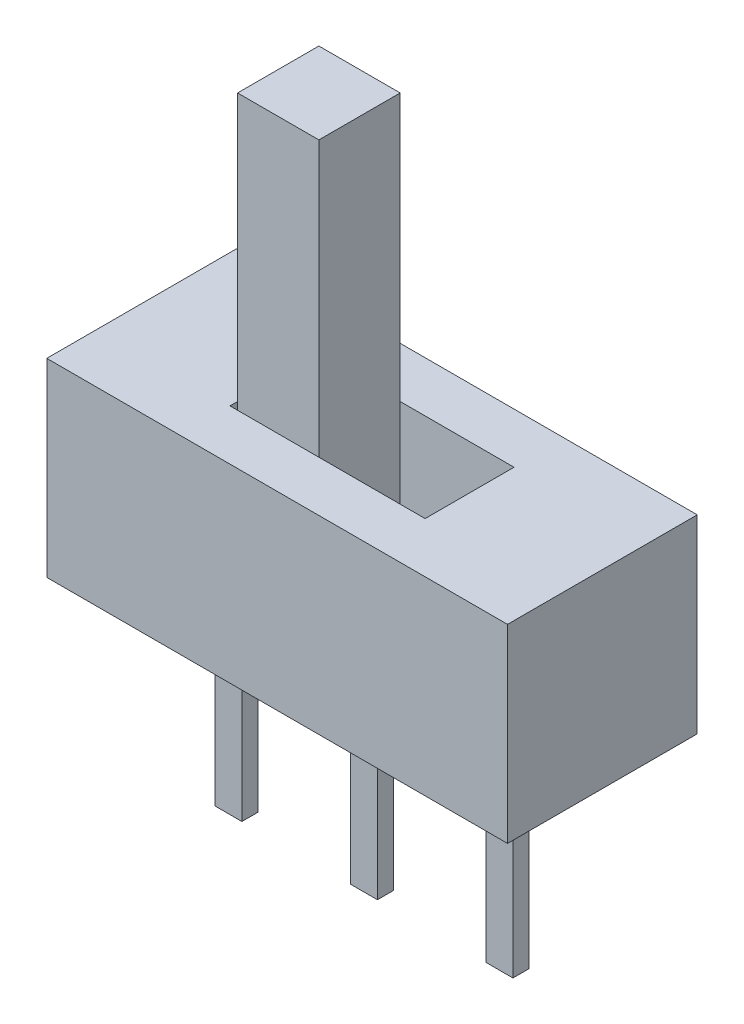
ISO-10303-21;
HEADER;
FILE_DESCRIPTION(('STEP AP214'),'2;1');
FILE_NAME('part.step','',(''),(''),'','','');
FILE_SCHEMA(('AUTOMOTIVE_DESIGN { 1 0 10303 214 1 1 1 1 }'));
ENDSEC;
DATA;
#1=APPLICATION_CONTEXT('core data for automotive mechanical design processes');
#2=APPLICATION_PROTOCOL_DEFINITION('international standard','automotive_design',2000,#1);
#3=PRODUCT_CONTEXT('',#1,'mechanical');
#4=PRODUCT('Part','Part','',(#3));
#5=PRODUCT_RELATED_PRODUCT_CATEGORY('part','',(#4));
#6=PRODUCT_DEFINITION_FORMATION('','',#4);
#7=PRODUCT_DEFINITION_CONTEXT('part definition',#1,'design');
#8=PRODUCT_DEFINITION('design','',#6,#7);
#9=PRODUCT_DEFINITION_SHAPE('','',#8);
#10=(LENGTH_UNIT() NAMED_UNIT(*) SI_UNIT(.MILLI.,.METRE.));
#11=(NAMED_UNIT(*) PLANE_ANGLE_UNIT() SI_UNIT($,.RADIAN.));
#12=(NAMED_UNIT(*) SI_UNIT($,.STERADIAN.) SOLID_ANGLE_UNIT());
#13=UNCERTAINTY_MEASURE_WITH_UNIT(LENGTH_MEASURE(1.E-05),#10,'distance_accuracy_value','');
#14=(GEOMETRIC_REPRESENTATION_CONTEXT(3) GLOBAL_UNCERTAINTY_ASSIGNED_CONTEXT((#13)) GLOBAL_UNIT_ASSIGNED_CONTEXT((#10,
#11,#12)) REPRESENTATION_CONTEXT('',''));
#15=CARTESIAN_POINT('',(0.,0.,0.));
#16=DIRECTION('',(0.,0.,1.));
#17=DIRECTION('',(1.,0.,0.));
#18=AXIS2_PLACEMENT_3D('',#15,#16,#17);
#19=CARTESIAN_POINT('',(0.,0.,0.));
#20=DIRECTION('',(0.,1.,0.));
#21=DIRECTION('',(0.,0.,1.));
#22=AXIS2_PLACEMENT_3D('',#19,#20,#21);
#23=PLANE('',#22);
#24=DIRECTION('',(0.,0.,1.));
#25=VECTOR('',#24,1.);
#26=CARTESIAN_POINT('',(-2.25,0.,0.15));
#27=LINE('',#26,#25);
#28=CARTESIAN_POINT('',(-2.25,0.,-0.15));
#29=VERTEX_POINT('',#28);
#30=CARTESIAN_POINT('',(-2.25,0.,0.15));
#31=VERTEX_POINT('',#30);
#32=EDGE_CURVE('E264',#29,#31,#27,.T.);
#33=ORIENTED_EDGE('',*,*,#32,.F.);
#34=DIRECTION('',(1.,0.,0.));
#35=VECTOR('',#34,1.);
#36=CARTESIAN_POINT('',(-2.75,0.,-0.15));
#37=LINE('',#36,#35);
#38=CARTESIAN_POINT('',(-2.75,0.,-0.15));
#39=VERTEX_POINT('',#38);
#40=EDGE_CURVE('E234',#39,#29,#37,.T.);
#41=ORIENTED_EDGE('',*,*,#40,.F.);
#42=DIRECTION('',(0.,0.,-1.));
#43=VECTOR('',#42,1.);
#44=CARTESIAN_POINT('',(-2.75,0.,0.15));
#45=LINE('',#44,#43);
#46=CARTESIAN_POINT('',(-2.75,0.,0.15));
#47=VERTEX_POINT('',#46);
#48=EDGE_CURVE('E252',#47,#39,#45,.T.);
#49=ORIENTED_EDGE('',*,*,#48,.F.);
#50=DIRECTION('',(-1.,0.,0.));
#51=VECTOR('',#50,1.);
#52=CARTESIAN_POINT('',(-2.75,0.,0.15));
#53=LINE('',#52,#51);
#54=EDGE_CURVE('E258',#31,#47,#53,.T.);
#55=ORIENTED_EDGE('',*,*,#54,.F.);
#56=EDGE_LOOP('',(#33,#41,#49,#55));
#57=FACE_BOUND('',#56,.T.);
#58=DIRECTION('',(0.,0.,-1.));
#59=VECTOR('',#58,1.);
#60=CARTESIAN_POINT('',(4.25,0.,-1.75));
#61=LINE('',#60,#59);
#62=CARTESIAN_POINT('',(4.25,0.,1.75));
#63=VERTEX_POINT('',#62);
#64=CARTESIAN_POINT('',(4.25,0.,-1.75));
#65=VERTEX_POINT('',#64);
#66=EDGE_CURVE('E357',#63,#65,#61,.T.);
#67=ORIENTED_EDGE('',*,*,#66,.F.);
#68=DIRECTION('',(1.,0.,0.));
#69=VECTOR('',#68,1.);
#70=CARTESIAN_POINT('',(-4.25,0.,1.75));
#71=LINE('',#70,#69);
#72=CARTESIAN_POINT('',(-4.25,0.,1.75));
#73=VERTEX_POINT('',#72);
#74=EDGE_CURVE('E368',#73,#63,#71,.T.);
#75=ORIENTED_EDGE('',*,*,#74,.F.);
#76=DIRECTION('',(0.,0.,1.));
#77=VECTOR('',#76,1.);
#78=CARTESIAN_POINT('',(-4.25,0.,-1.75));
#79=LINE('',#78,#77);
#80=CARTESIAN_POINT('',(-4.25,0.,-1.75));
#81=VERTEX_POINT('',#80);
#82=EDGE_CURVE('E379',#81,#73,#79,.T.);
#83=ORIENTED_EDGE('',*,*,#82,.F.);
#84=DIRECTION('',(-1.,0.,0.));
#85=VECTOR('',#84,1.);
#86=CARTESIAN_POINT('',(-4.25,0.,-1.75));
#87=LINE('',#86,#85);
#88=EDGE_CURVE('E377',#65,#81,#87,.T.);
#89=ORIENTED_EDGE('',*,*,#88,.F.);
#90=EDGE_LOOP('',(#67,#75,#83,#89));
#91=FACE_BOUND('',#90,.T.);
#92=DIRECTION('',(0.,0.,1.));
#93=VECTOR('',#92,1.);
#94=CARTESIAN_POINT('',(0.25,0.,0.15));
#95=LINE('',#94,#93);
#96=CARTESIAN_POINT('',(0.25,0.,-0.15));
#97=VERTEX_POINT('',#96);
#98=CARTESIAN_POINT('',(0.25,0.,0.15));
#99=VERTEX_POINT('',#98);
#100=EDGE_CURVE('E229',#97,#99,#95,.T.);
#101=ORIENTED_EDGE('',*,*,#100,.F.);
#102=DIRECTION('',(1.,0.,0.));
#103=VECTOR('',#102,1.);
#104=CARTESIAN_POINT('',(-0.25,0.,-0.15));
#105=LINE('',#104,#103);
#106=CARTESIAN_POINT('',(-0.25,0.,-0.15));
#107=VERTEX_POINT('',#106);
#108=EDGE_CURVE('E271',#107,#97,#105,.T.);
#109=ORIENTED_EDGE('',*,*,#108,.F.);
#110=DIRECTION('',(0.,0.,-1.));
#111=VECTOR('',#110,1.);
#112=CARTESIAN_POINT('',(-0.25,0.,0.15));
#113=LINE('',#112,#111);
#114=CARTESIAN_POINT('',(-0.25,0.,0.15));
#115=VERTEX_POINT('',#114);
#116=EDGE_CURVE('E283',#115,#107,#113,.T.);
#117=ORIENTED_EDGE('',*,*,#116,.F.);
#118=DIRECTION('',(-1.,0.,0.));
#119=VECTOR('',#118,1.);
#120=CARTESIAN_POINT('',(-0.25,0.,0.15));
#121=LINE('',#120,#119);
#122=EDGE_CURVE('E280',#99,#115,#121,.T.);
#123=ORIENTED_EDGE('',*,*,#122,.F.);
#124=EDGE_LOOP('',(#101,#109,#117,#123));
#125=FACE_BOUND('',#124,.T.);
#126=DIRECTION('',(0.,0.,1.));
#127=VECTOR('',#126,1.);
#128=CARTESIAN_POINT('',(2.75,0.,0.15));
#129=LINE('',#128,#127);
#130=CARTESIAN_POINT('',(2.75,0.,-0.15));
#131=VERTEX_POINT('',#130);
#132=CARTESIAN_POINT('',(2.75,0.,0.15));
#133=VERTEX_POINT('',#132);
#134=EDGE_CURVE('E227',#131,#133,#129,.T.);
#135=ORIENTED_EDGE('',*,*,#134,.F.);
#136=DIRECTION('',(1.,0.,0.));
#137=VECTOR('',#136,1.);
#138=CARTESIAN_POINT('',(2.25,0.,-0.15));
#139=LINE('',#138,#137);
#140=CARTESIAN_POINT('',(2.25,0.,-0.15));
#141=VERTEX_POINT('',#140);
#142=EDGE_CURVE('E216',#141,#131,#139,.T.);
#143=ORIENTED_EDGE('',*,*,#142,.F.);
#144=DIRECTION('',(0.,0.,-1.));
#145=VECTOR('',#144,1.);
#146=CARTESIAN_POINT('',(2.25,0.,0.15));
#147=LINE('',#146,#145);
#148=CARTESIAN_POINT('',(2.25,0.,0.15));
#149=VERTEX_POINT('',#148);
#150=EDGE_CURVE('E66',#149,#141,#147,.T.);
#151=ORIENTED_EDGE('',*,*,#150,.F.);
#152=DIRECTION('',(-1.,0.,0.));
#153=VECTOR('',#152,1.);
#154=CARTESIAN_POINT('',(2.25,0.,0.15));
#155=LINE('',#154,#153);
#156=EDGE_CURVE('E61',#133,#149,#155,.T.);
#157=ORIENTED_EDGE('',*,*,#156,.F.);
#158=EDGE_LOOP('',(#135,#143,#151,#157));
#159=FACE_BOUND('',#158,.T.);
#160=ADVANCED_FACE('F46',(#57,#91,#125,#159),#23,.F.);
#161=CARTESIAN_POINT('',(0.,1.5,0.));
#162=DIRECTION('',(0.,1.,0.));
#163=DIRECTION('',(0.,0.,1.));
#164=AXIS2_PLACEMENT_3D('',#161,#162,#163);
#165=PLANE('',#164);
#166=DIRECTION('',(0.,0.,-1.));
#167=VECTOR('',#166,1.);
#168=CARTESIAN_POINT('',(1.8,1.5,-0.82));
#169=LINE('',#168,#167);
#170=CARTESIAN_POINT('',(1.8,1.5,0.82));
#171=VERTEX_POINT('',#170);
#172=CARTESIAN_POINT('',(1.8,1.5,-0.82));
#173=VERTEX_POINT('',#172);
#174=EDGE_CURVE('E332',#171,#173,#169,.T.);
#175=ORIENTED_EDGE('',*,*,#174,.T.);
#176=DIRECTION('',(-1.,0.,0.));
#177=VECTOR('',#176,1.);
#178=CARTESIAN_POINT('',(-1.8,1.5,-0.82));
#179=LINE('',#178,#177);
#180=CARTESIAN_POINT('',(-1.8,1.5,-0.82));
#181=VERTEX_POINT('',#180);
#182=EDGE_CURVE('E335',#173,#181,#179,.T.);
#183=ORIENTED_EDGE('',*,*,#182,.T.);
#184=DIRECTION('',(0.,0.,1.));
#185=VECTOR('',#184,1.);
#186=CARTESIAN_POINT('',(-1.8,1.5,-0.82));
#187=LINE('',#186,#185);
#188=CARTESIAN_POINT('',(-1.8,1.5,0.82));
#189=VERTEX_POINT('',#188);
#190=EDGE_CURVE('E339',#181,#189,#187,.T.);
#191=ORIENTED_EDGE('',*,*,#190,.T.);
#192=DIRECTION('',(1.,0.,0.));
#193=VECTOR('',#192,1.);
#194=CARTESIAN_POINT('',(-1.8,1.5,0.82));
#195=LINE('',#194,#193);
#196=EDGE_CURVE('E342',#189,#171,#195,.T.);
#197=ORIENTED_EDGE('',*,*,#196,.T.);
#198=EDGE_LOOP('',(#175,#183,#191,#197));
#199=FACE_BOUND('',#198,.T.);
#200=DIRECTION('',(-1.,0.,0.));
#201=VECTOR('',#200,1.);
#202=CARTESIAN_POINT('',(-1.73,1.5,-0.75));
#203=LINE('',#202,#201);
#204=CARTESIAN_POINT('',(-0.23,1.5,-0.75));
#205=VERTEX_POINT('',#204);
#206=CARTESIAN_POINT('',(-1.73,1.5,-0.75));
#207=VERTEX_POINT('',#206);
#208=EDGE_CURVE('E308',#205,#207,#203,.T.);
#209=ORIENTED_EDGE('',*,*,#208,.F.);
#210=DIRECTION('',(0.,0.,-1.));
#211=VECTOR('',#210,1.);
#212=CARTESIAN_POINT('',(-0.23,1.5,-0.75));
#213=LINE('',#212,#211);
#214=CARTESIAN_POINT('',(-0.23,1.5,0.75));
#215=VERTEX_POINT('',#214);
#216=EDGE_CURVE('E312',#215,#205,#213,.T.);
#217=ORIENTED_EDGE('',*,*,#216,.F.);
#218=DIRECTION('',(1.,0.,0.));
#219=VECTOR('',#218,1.);
#220=CARTESIAN_POINT('',(-1.73,1.5,0.75));
#221=LINE('',#220,#219);
#222=CARTESIAN_POINT('',(-1.73,1.5,0.75));
#223=VERTEX_POINT('',#222);
#224=EDGE_CURVE('E300',#223,#215,#221,.T.);
#225=ORIENTED_EDGE('',*,*,#224,.F.);
#226=DIRECTION('',(0.,0.,1.));
#227=VECTOR('',#226,1.);
#228=CARTESIAN_POINT('',(-1.73,1.5,-0.75));
#229=LINE('',#228,#227);
#230=EDGE_CURVE('E305',#207,#223,#229,.T.);
#231=ORIENTED_EDGE('',*,*,#230,.F.);
#232=EDGE_LOOP('',(#209,#217,#225,#231));
#233=FACE_BOUND('',#232,.T.);
#234=ADVANCED_FACE('F414',(#199,#233),#165,.T.);
#235=CARTESIAN_POINT('',(4.25,3.5,-1.75));
#236=DIRECTION('',(-1.,0.,0.));
#237=DIRECTION('',(0.,0.,1.));
#238=AXIS2_PLACEMENT_3D('',#235,#236,#237);
#239=PLANE('',#238);
#240=ORIENTED_EDGE('',*,*,#66,.T.);
#241=DIRECTION('',(0.,-1.,0.));
#242=VECTOR('',#241,1.);
#243=CARTESIAN_POINT('',(4.25,3.5,-1.75));
#244=LINE('',#243,#242);
#245=CARTESIAN_POINT('',(4.25,3.5,-1.75));
#246=VERTEX_POINT('',#245);
#247=EDGE_CURVE('E12',#246,#65,#244,.T.);
#248=ORIENTED_EDGE('',*,*,#247,.F.);
#249=DIRECTION('',(0.,0.,-1.));
#250=VECTOR('',#249,1.);
#251=CARTESIAN_POINT('',(4.25,3.5,-1.75));
#252=LINE('',#251,#250);
#253=CARTESIAN_POINT('',(4.25,3.5,1.75));
#254=VERTEX_POINT('',#253);
#255=EDGE_CURVE('E364',#254,#246,#252,.T.);
#256=ORIENTED_EDGE('',*,*,#255,.F.);
#257=DIRECTION('',(0.,-1.,0.));
#258=VECTOR('',#257,1.);
#259=CARTESIAN_POINT('',(4.25,3.5,1.75));
#260=LINE('',#259,#258);
#261=EDGE_CURVE('E374',#254,#63,#260,.T.);
#262=ORIENTED_EDGE('',*,*,#261,.T.);
#263=EDGE_LOOP('',(#240,#248,#256,#262));
#264=FACE_BOUND('',#263,.T.);
#265=ADVANCED_FACE('F48',(#264),#239,.F.);
#266=CARTESIAN_POINT('',(-4.25,3.5,-1.75));
#267=DIRECTION('',(0.,0.,1.));
#268=DIRECTION('',(1.,0.,0.));
#269=AXIS2_PLACEMENT_3D('',#266,#267,#268);
#270=PLANE('',#269);
#271=ORIENTED_EDGE('',*,*,#88,.T.);
#272=DIRECTION('',(0.,-1.,0.));
#273=VECTOR('',#272,1.);
#274=CARTESIAN_POINT('',(-4.25,3.5,-1.75));
#275=LINE('',#274,#273);
#276=CARTESIAN_POINT('',(-4.25,3.5,-1.75));
#277=VERTEX_POINT('',#276);
#278=EDGE_CURVE('E54',#277,#81,#275,.T.);
#279=ORIENTED_EDGE('',*,*,#278,.F.);
#280=DIRECTION('',(-1.,0.,0.));
#281=VECTOR('',#280,1.);
#282=CARTESIAN_POINT('',(-4.25,3.5,-1.75));
#283=LINE('',#282,#281);
#284=EDGE_CURVE('E367',#246,#277,#283,.T.);
#285=ORIENTED_EDGE('',*,*,#284,.F.);
#286=ORIENTED_EDGE('',*,*,#247,.T.);
#287=EDGE_LOOP('',(#271,#279,#285,#286));
#288=FACE_BOUND('',#287,.T.);
#289=ADVANCED_FACE('F407',(#288),#270,.F.);
#290=CARTESIAN_POINT('',(-4.25,3.5,-1.75));
#291=DIRECTION('',(1.,0.,0.));
#292=DIRECTION('',(0.,0.,-1.));
#293=AXIS2_PLACEMENT_3D('',#290,#291,#292);
#294=PLANE('',#293);
#295=ORIENTED_EDGE('',*,*,#82,.T.);
#296=DIRECTION('',(0.,-1.,0.));
#297=VECTOR('',#296,1.);
#298=CARTESIAN_POINT('',(-4.25,3.5,1.75));
#299=LINE('',#298,#297);
#300=CARTESIAN_POINT('',(-4.25,3.5,1.75));
#301=VERTEX_POINT('',#300);
#302=EDGE_CURVE('E384',#301,#73,#299,.T.);
#303=ORIENTED_EDGE('',*,*,#302,.F.);
#304=DIRECTION('',(0.,0.,1.));
#305=VECTOR('',#304,1.);
#306=CARTESIAN_POINT('',(-4.25,3.5,-1.75));
#307=LINE('',#306,#305);
#308=EDGE_CURVE('E370',#277,#301,#307,.T.);
#309=ORIENTED_EDGE('',*,*,#308,.F.);
#310=ORIENTED_EDGE('',*,*,#278,.T.);
#311=EDGE_LOOP('',(#295,#303,#309,#310));
#312=FACE_BOUND('',#311,.T.);
#313=ADVANCED_FACE('F391',(#312),#294,.F.);
#314=CARTESIAN_POINT('',(-4.25,3.5,1.75));
#315=DIRECTION('',(0.,0.,-1.));
#316=DIRECTION('',(-1.,0.,0.));
#317=AXIS2_PLACEMENT_3D('',#314,#315,#316);
#318=PLANE('',#317);
#319=ORIENTED_EDGE('',*,*,#74,.T.);
#320=ORIENTED_EDGE('',*,*,#261,.F.);
#321=DIRECTION('',(1.,0.,0.));
#322=VECTOR('',#321,1.);
#323=CARTESIAN_POINT('',(-4.25,3.5,1.75));
#324=LINE('',#323,#322);
#325=EDGE_CURVE('E372',#301,#254,#324,.T.);
#326=ORIENTED_EDGE('',*,*,#325,.F.);
#327=ORIENTED_EDGE('',*,*,#302,.T.);
#328=EDGE_LOOP('',(#319,#320,#326,#327));
#329=FACE_BOUND('',#328,.T.);
#330=ADVANCED_FACE('F400',(#329),#318,.F.);
#331=CARTESIAN_POINT('',(0.,3.5,0.));
#332=DIRECTION('',(0.,1.,0.));
#333=DIRECTION('',(0.,0.,1.));
#334=AXIS2_PLACEMENT_3D('',#331,#332,#333);
#335=PLANE('',#334);
#336=DIRECTION('',(0.,0.,-1.));
#337=VECTOR('',#336,1.);
#338=CARTESIAN_POINT('',(1.8,3.5,-0.82));
#339=LINE('',#338,#337);
#340=CARTESIAN_POINT('',(1.8,3.5,0.82));
#341=VERTEX_POINT('',#340);
#342=CARTESIAN_POINT('',(1.8,3.5,-0.82));
#343=VERTEX_POINT('',#342);
#344=EDGE_CURVE('E318',#341,#343,#339,.T.);
#345=ORIENTED_EDGE('',*,*,#344,.F.);
#346=DIRECTION('',(1.,0.,0.));
#347=VECTOR('',#346,1.);
#348=CARTESIAN_POINT('',(-1.8,3.5,0.82));
#349=LINE('',#348,#347);
#350=CARTESIAN_POINT('',(-1.8,3.5,0.82));
#351=VERTEX_POINT('',#350);
#352=EDGE_CURVE('E336',#351,#341,#349,.T.);
#353=ORIENTED_EDGE('',*,*,#352,.F.);
#354=DIRECTION('',(0.,0.,1.));
#355=VECTOR('',#354,1.);
#356=CARTESIAN_POINT('',(-1.8,3.5,-0.82));
#357=LINE('',#356,#355);
#358=CARTESIAN_POINT('',(-1.8,3.5,-0.82));
#359=VERTEX_POINT('',#358);
#360=EDGE_CURVE('E350',#359,#351,#357,.T.);
#361=ORIENTED_EDGE('',*,*,#360,.F.);
#362=DIRECTION('',(-1.,0.,0.));
#363=VECTOR('',#362,1.);
#364=CARTESIAN_POINT('',(-1.8,3.5,-0.82));
#365=LINE('',#364,#363);
#366=EDGE_CURVE('E347',#343,#359,#365,.T.);
#367=ORIENTED_EDGE('',*,*,#366,.F.);
#368=EDGE_LOOP('',(#345,#353,#361,#367));
#369=FACE_BOUND('',#368,.T.);
#370=ORIENTED_EDGE('',*,*,#255,.T.);
#371=ORIENTED_EDGE('',*,*,#284,.T.);
#372=ORIENTED_EDGE('',*,*,#308,.T.);
#373=ORIENTED_EDGE('',*,*,#325,.T.);
#374=EDGE_LOOP('',(#370,#371,#372,#373));
#375=FACE_BOUND('',#374,.T.);
#376=ADVANCED_FACE('F406',(#369,#375),#335,.T.);
#377=CARTESIAN_POINT('',(1.8,1.5,-0.82));
#378=DIRECTION('',(1.,0.,0.));
#379=DIRECTION('',(0.,0.,-1.));
#380=AXIS2_PLACEMENT_3D('',#377,#378,#379);
#381=PLANE('',#380);
#382=ORIENTED_EDGE('',*,*,#344,.T.);
#383=DIRECTION('',(0.,1.,0.));
#384=VECTOR('',#383,1.);
#385=CARTESIAN_POINT('',(1.8,1.5,-0.82));
#386=LINE('',#385,#384);
#387=EDGE_CURVE('E345',#173,#343,#386,.T.);
#388=ORIENTED_EDGE('',*,*,#387,.F.);
#389=ORIENTED_EDGE('',*,*,#174,.F.);
#390=DIRECTION('',(0.,1.,0.));
#391=VECTOR('',#390,1.);
#392=CARTESIAN_POINT('',(1.8,1.5,0.82));
#393=LINE('',#392,#391);
#394=EDGE_CURVE('E355',#171,#341,#393,.T.);
#395=ORIENTED_EDGE('',*,*,#394,.T.);
#396=EDGE_LOOP('',(#382,#388,#389,#395));
#397=FACE_BOUND('',#396,.T.);
#398=ADVANCED_FACE('F430',(#397),#381,.F.);
#399=CARTESIAN_POINT('',(-1.8,1.5,0.82));
#400=DIRECTION('',(0.,0.,1.));
#401=DIRECTION('',(1.,0.,0.));
#402=AXIS2_PLACEMENT_3D('',#399,#400,#401);
#403=PLANE('',#402);
#404=ORIENTED_EDGE('',*,*,#352,.T.);
#405=ORIENTED_EDGE('',*,*,#394,.F.);
#406=ORIENTED_EDGE('',*,*,#196,.F.);
#407=DIRECTION('',(0.,1.,0.));
#408=VECTOR('',#407,1.);
#409=CARTESIAN_POINT('',(-1.8,1.5,0.82));
#410=LINE('',#409,#408);
#411=EDGE_CURVE('E358',#189,#351,#410,.T.);
#412=ORIENTED_EDGE('',*,*,#411,.T.);
#413=EDGE_LOOP('',(#404,#405,#406,#412));
#414=FACE_BOUND('',#413,.T.);
#415=ADVANCED_FACE('F435',(#414),#403,.F.);
#416=CARTESIAN_POINT('',(-1.8,1.5,-0.82));
#417=DIRECTION('',(-1.,0.,0.));
#418=DIRECTION('',(0.,0.,1.));
#419=AXIS2_PLACEMENT_3D('',#416,#417,#418);
#420=PLANE('',#419);
#421=ORIENTED_EDGE('',*,*,#360,.T.);
#422=ORIENTED_EDGE('',*,*,#411,.F.);
#423=ORIENTED_EDGE('',*,*,#190,.F.);
#424=DIRECTION('',(0.,1.,0.));
#425=VECTOR('',#424,1.);
#426=CARTESIAN_POINT('',(-1.8,1.5,-0.82));
#427=LINE('',#426,#425);
#428=EDGE_CURVE('E360',#181,#359,#427,.T.);
#429=ORIENTED_EDGE('',*,*,#428,.T.);
#430=EDGE_LOOP('',(#421,#422,#423,#429));
#431=FACE_BOUND('',#430,.T.);
#432=ADVANCED_FACE('F450',(#431),#420,.F.);
#433=CARTESIAN_POINT('',(-1.8,1.5,-0.82));
#434=DIRECTION('',(0.,0.,-1.));
#435=DIRECTION('',(-1.,0.,0.));
#436=AXIS2_PLACEMENT_3D('',#433,#434,#435);
#437=PLANE('',#436);
#438=ORIENTED_EDGE('',*,*,#366,.T.);
#439=ORIENTED_EDGE('',*,*,#428,.F.);
#440=ORIENTED_EDGE('',*,*,#182,.F.);
#441=ORIENTED_EDGE('',*,*,#387,.T.);
#442=EDGE_LOOP('',(#438,#439,#440,#441));
#443=FACE_BOUND('',#442,.T.);
#444=ADVANCED_FACE('F444',(#443),#437,.F.);
#445=CARTESIAN_POINT('',(-0.23,15.6213203435596,-0.75));
#446=DIRECTION('',(-1.,0.,0.));
#447=DIRECTION('',(0.,0.,1.));
#448=AXIS2_PLACEMENT_3D('',#445,#446,#447);
#449=PLANE('',#448);
#450=DIRECTION('',(0.,0.,-1.));
#451=VECTOR('',#450,1.);
#452=CARTESIAN_POINT('',(-0.23,8.5,-0.75));
#453=LINE('',#452,#451);
#454=CARTESIAN_POINT('',(-0.23,8.5,0.75));
#455=VERTEX_POINT('',#454);
#456=CARTESIAN_POINT('',(-0.23,8.5,-0.75));
#457=VERTEX_POINT('',#456);
#458=EDGE_CURVE('E322',#455,#457,#453,.T.);
#459=ORIENTED_EDGE('',*,*,#458,.F.);
#460=DIRECTION('',(0.,-1.,0.));
#461=VECTOR('',#460,1.);
#462=CARTESIAN_POINT('',(-0.23,15.6213203435596,0.75));
#463=LINE('',#462,#461);
#464=EDGE_CURVE('E299',#455,#215,#463,.T.);
#465=ORIENTED_EDGE('',*,*,#464,.T.);
#466=ORIENTED_EDGE('',*,*,#216,.T.);
#467=DIRECTION('',(0.,-1.,0.));
#468=VECTOR('',#467,1.);
#469=CARTESIAN_POINT('',(-0.23,15.6213203435596,-0.75));
#470=LINE('',#469,#468);
#471=EDGE_CURVE('E311',#457,#205,#470,.T.);
#472=ORIENTED_EDGE('',*,*,#471,.F.);
#473=EDGE_LOOP('',(#459,#465,#466,#472));
#474=FACE_BOUND('',#473,.T.);
#475=ADVANCED_FACE('F457',(#474),#449,.F.);
#476=CARTESIAN_POINT('',(-1.73,15.6213203435596,-0.75));
#477=DIRECTION('',(0.,0.,1.));
#478=DIRECTION('',(1.,0.,0.));
#479=AXIS2_PLACEMENT_3D('',#476,#477,#478);
#480=PLANE('',#479);
#481=DIRECTION('',(-1.,0.,0.));
#482=VECTOR('',#481,1.);
#483=CARTESIAN_POINT('',(-1.73,8.5,-0.75));
#484=LINE('',#483,#482);
#485=CARTESIAN_POINT('',(-1.73,8.5,-0.75));
#486=VERTEX_POINT('',#485);
#487=EDGE_CURVE('E319',#457,#486,#484,.T.);
#488=ORIENTED_EDGE('',*,*,#487,.F.);
#489=ORIENTED_EDGE('',*,*,#471,.T.);
#490=ORIENTED_EDGE('',*,*,#208,.T.);
#491=DIRECTION('',(0.,-1.,0.));
#492=VECTOR('',#491,1.);
#493=CARTESIAN_POINT('',(-1.73,15.6213203435596,-0.75));
#494=LINE('',#493,#492);
#495=EDGE_CURVE('E307',#486,#207,#494,.T.);
#496=ORIENTED_EDGE('',*,*,#495,.F.);
#497=EDGE_LOOP('',(#488,#489,#490,#496));
#498=FACE_BOUND('',#497,.T.);
#499=ADVANCED_FACE('F469',(#498),#480,.F.);
#500=CARTESIAN_POINT('',(-1.73,15.6213203435596,-0.75));
#501=DIRECTION('',(1.,0.,0.));
#502=DIRECTION('',(0.,0.,-1.));
#503=AXIS2_PLACEMENT_3D('',#500,#501,#502);
#504=PLANE('',#503);
#505=DIRECTION('',(0.,0.,1.));
#506=VECTOR('',#505,1.);
#507=CARTESIAN_POINT('',(-1.73,8.5,-0.75));
#508=LINE('',#507,#506);
#509=CARTESIAN_POINT('',(-1.73,8.5,0.75));
#510=VERTEX_POINT('',#509);
#511=EDGE_CURVE('E315',#486,#510,#508,.T.);
#512=ORIENTED_EDGE('',*,*,#511,.F.);
#513=ORIENTED_EDGE('',*,*,#495,.T.);
#514=ORIENTED_EDGE('',*,*,#230,.T.);
#515=DIRECTION('',(0.,-1.,0.));
#516=VECTOR('',#515,1.);
#517=CARTESIAN_POINT('',(-1.73,15.6213203435596,0.75));
#518=LINE('',#517,#516);
#519=EDGE_CURVE('E304',#510,#223,#518,.T.);
#520=ORIENTED_EDGE('',*,*,#519,.F.);
#521=EDGE_LOOP('',(#512,#513,#514,#520));
#522=FACE_BOUND('',#521,.T.);
#523=ADVANCED_FACE('F473',(#522),#504,.F.);
#524=CARTESIAN_POINT('',(-1.73,15.6213203435596,0.75));
#525=DIRECTION('',(0.,0.,-1.));
#526=DIRECTION('',(-1.,0.,0.));
#527=AXIS2_PLACEMENT_3D('',#524,#525,#526);
#528=PLANE('',#527);
#529=DIRECTION('',(1.,0.,0.));
#530=VECTOR('',#529,1.);
#531=CARTESIAN_POINT('',(-1.73,8.5,0.75));
#532=LINE('',#531,#530);
#533=EDGE_CURVE('E303',#510,#455,#532,.T.);
#534=ORIENTED_EDGE('',*,*,#533,.F.);
#535=ORIENTED_EDGE('',*,*,#519,.T.);
#536=ORIENTED_EDGE('',*,*,#224,.T.);
#537=ORIENTED_EDGE('',*,*,#464,.F.);
#538=EDGE_LOOP('',(#534,#535,#536,#537));
#539=FACE_BOUND('',#538,.T.);
#540=ADVANCED_FACE('F465',(#539),#528,.F.);
#541=CARTESIAN_POINT('',(0.,8.5,0.));
#542=DIRECTION('',(0.,1.,0.));
#543=DIRECTION('',(0.,0.,1.));
#544=AXIS2_PLACEMENT_3D('',#541,#542,#543);
#545=PLANE('',#544);
#546=ORIENTED_EDGE('',*,*,#533,.T.);
#547=ORIENTED_EDGE('',*,*,#458,.T.);
#548=ORIENTED_EDGE('',*,*,#487,.T.);
#549=ORIENTED_EDGE('',*,*,#511,.T.);
#550=EDGE_LOOP('',(#546,#547,#548,#549));
#551=FACE_BOUND('',#550,.T.);
#552=ADVANCED_FACE('F461',(#551),#545,.T.);
#553=CARTESIAN_POINT('',(0.25,-3.7,0.15));
#554=DIRECTION('',(-1.,0.,0.));
#555=DIRECTION('',(0.,0.,1.));
#556=AXIS2_PLACEMENT_3D('',#553,#554,#555);
#557=PLANE('',#556);
#558=ORIENTED_EDGE('',*,*,#100,.T.);
#559=DIRECTION('',(0.,1.,0.));
#560=VECTOR('',#559,1.);
#561=CARTESIAN_POINT('',(0.25,-3.7,0.15));
#562=LINE('',#561,#560);
#563=CARTESIAN_POINT('',(0.25,-3.7,0.15));
#564=VERTEX_POINT('',#563);
#565=EDGE_CURVE('E296',#564,#99,#562,.T.);
#566=ORIENTED_EDGE('',*,*,#565,.F.);
#567=DIRECTION('',(0.,0.,1.));
#568=VECTOR('',#567,1.);
#569=CARTESIAN_POINT('',(0.25,-3.7,0.15));
#570=LINE('',#569,#568);
#571=CARTESIAN_POINT('',(0.25,-3.7,-0.15));
#572=VERTEX_POINT('',#571);
#573=EDGE_CURVE('E267',#572,#564,#570,.T.);
#574=ORIENTED_EDGE('',*,*,#573,.F.);
#575=DIRECTION('',(0.,1.,0.));
#576=VECTOR('',#575,1.);
#577=CARTESIAN_POINT('',(0.25,-3.7,-0.15));
#578=LINE('',#577,#576);
#579=EDGE_CURVE('E277',#572,#97,#578,.T.);
#580=ORIENTED_EDGE('',*,*,#579,.T.);
#581=EDGE_LOOP('',(#558,#566,#574,#580));
#582=FACE_BOUND('',#581,.T.);
#583=ADVANCED_FACE('F464',(#582),#557,.F.);
#584=CARTESIAN_POINT('',(-0.25,-3.7,0.15));
#585=DIRECTION('',(0.,0.,-1.));
#586=DIRECTION('',(-1.,0.,0.));
#587=AXIS2_PLACEMENT_3D('',#584,#585,#586);
#588=PLANE('',#587);
#589=ORIENTED_EDGE('',*,*,#122,.T.);
#590=DIRECTION('',(0.,1.,0.));
#591=VECTOR('',#590,1.);
#592=CARTESIAN_POINT('',(-0.25,-3.7,0.15));
#593=LINE('',#592,#591);
#594=CARTESIAN_POINT('',(-0.25,-3.7,0.15));
#595=VERTEX_POINT('',#594);
#596=EDGE_CURVE('E293',#595,#115,#593,.T.);
#597=ORIENTED_EDGE('',*,*,#596,.F.);
#598=DIRECTION('',(-1.,0.,0.));
#599=VECTOR('',#598,1.);
#600=CARTESIAN_POINT('',(-0.25,-3.7,0.15));
#601=LINE('',#600,#599);
#602=EDGE_CURVE('E270',#564,#595,#601,.T.);
#603=ORIENTED_EDGE('',*,*,#602,.F.);
#604=ORIENTED_EDGE('',*,*,#565,.T.);
#605=EDGE_LOOP('',(#589,#597,#603,#604));
#606=FACE_BOUND('',#605,.T.);
#607=ADVANCED_FACE('F483',(#606),#588,.F.);
#608=CARTESIAN_POINT('',(-0.25,-3.7,0.15));
#609=DIRECTION('',(1.,0.,0.));
#610=DIRECTION('',(0.,0.,-1.));
#611=AXIS2_PLACEMENT_3D('',#608,#609,#610);
#612=PLANE('',#611);
#613=ORIENTED_EDGE('',*,*,#116,.T.);
#614=DIRECTION('',(0.,1.,0.));
#615=VECTOR('',#614,1.);
#616=CARTESIAN_POINT('',(-0.25,-3.7,-0.15));
#617=LINE('',#616,#615);
#618=CARTESIAN_POINT('',(-0.25,-3.7,-0.15));
#619=VERTEX_POINT('',#618);
#620=EDGE_CURVE('E290',#619,#107,#617,.T.);
#621=ORIENTED_EDGE('',*,*,#620,.F.);
#622=DIRECTION('',(0.,0.,-1.));
#623=VECTOR('',#622,1.);
#624=CARTESIAN_POINT('',(-0.25,-3.7,0.15));
#625=LINE('',#624,#623);
#626=EDGE_CURVE('E273',#595,#619,#625,.T.);
#627=ORIENTED_EDGE('',*,*,#626,.F.);
#628=ORIENTED_EDGE('',*,*,#596,.T.);
#629=EDGE_LOOP('',(#613,#621,#627,#628));
#630=FACE_BOUND('',#629,.T.);
#631=ADVANCED_FACE('F487',(#630),#612,.F.);
#632=CARTESIAN_POINT('',(-0.25,-3.7,-0.15));
#633=DIRECTION('',(0.,0.,1.));
#634=DIRECTION('',(1.,0.,0.));
#635=AXIS2_PLACEMENT_3D('',#632,#633,#634);
#636=PLANE('',#635);
#637=ORIENTED_EDGE('',*,*,#108,.T.);
#638=ORIENTED_EDGE('',*,*,#579,.F.);
#639=DIRECTION('',(1.,0.,0.));
#640=VECTOR('',#639,1.);
#641=CARTESIAN_POINT('',(-0.25,-3.7,-0.15));
#642=LINE('',#641,#640);
#643=EDGE_CURVE('E275',#619,#572,#642,.T.);
#644=ORIENTED_EDGE('',*,*,#643,.F.);
#645=ORIENTED_EDGE('',*,*,#620,.T.);
#646=EDGE_LOOP('',(#637,#638,#644,#645));
#647=FACE_BOUND('',#646,.T.);
#648=ADVANCED_FACE('F491',(#647),#636,.F.);
#649=CARTESIAN_POINT('',(0.,-3.7,0.));
#650=DIRECTION('',(0.,-1.,0.));
#651=DIRECTION('',(0.,0.,-1.));
#652=AXIS2_PLACEMENT_3D('',#649,#650,#651);
#653=PLANE('',#652);
#654=ORIENTED_EDGE('',*,*,#573,.T.);
#655=ORIENTED_EDGE('',*,*,#602,.T.);
#656=ORIENTED_EDGE('',*,*,#626,.T.);
#657=ORIENTED_EDGE('',*,*,#643,.T.);
#658=EDGE_LOOP('',(#654,#655,#656,#657));
#659=FACE_BOUND('',#658,.T.);
#660=ADVANCED_FACE('F495',(#659),#653,.T.);
#661=CARTESIAN_POINT('',(-2.25,-3.7,0.15));
#662=DIRECTION('',(-1.,0.,0.));
#663=DIRECTION('',(0.,0.,1.));
#664=AXIS2_PLACEMENT_3D('',#661,#662,#663);
#665=PLANE('',#664);
#666=ORIENTED_EDGE('',*,*,#32,.T.);
#667=DIRECTION('',(0.,1.,0.));
#668=VECTOR('',#667,1.);
#669=CARTESIAN_POINT('',(-2.25,-3.7,0.15));
#670=LINE('',#669,#668);
#671=CARTESIAN_POINT('',(-2.25,-3.7,0.15));
#672=VERTEX_POINT('',#671);
#673=EDGE_CURVE('E261',#672,#31,#670,.T.);
#674=ORIENTED_EDGE('',*,*,#673,.F.);
#675=DIRECTION('',(0.,0.,1.));
#676=VECTOR('',#675,1.);
#677=CARTESIAN_POINT('',(-2.25,-3.7,0.15));
#678=LINE('',#677,#676);
#679=CARTESIAN_POINT('',(-2.25,-3.7,-0.15));
#680=VERTEX_POINT('',#679);
#681=EDGE_CURVE('E237',#680,#672,#678,.T.);
#682=ORIENTED_EDGE('',*,*,#681,.F.);
#683=DIRECTION('',(0.,1.,0.));
#684=VECTOR('',#683,1.);
#685=CARTESIAN_POINT('',(-2.25,-3.7,-0.15));
#686=LINE('',#685,#684);
#687=EDGE_CURVE('E246',#680,#29,#686,.T.);
#688=ORIENTED_EDGE('',*,*,#687,.T.);
#689=EDGE_LOOP('',(#666,#674,#682,#688));
#690=FACE_BOUND('',#689,.T.);
#691=ADVANCED_FACE('F499',(#690),#665,.F.);
#692=CARTESIAN_POINT('',(-2.75,-3.7,0.15));
#693=DIRECTION('',(0.,0.,-1.));
#694=DIRECTION('',(-1.,0.,0.));
#695=AXIS2_PLACEMENT_3D('',#692,#693,#694);
#696=PLANE('',#695);
#697=ORIENTED_EDGE('',*,*,#54,.T.);
#698=DIRECTION('',(0.,1.,0.));
#699=VECTOR('',#698,1.);
#700=CARTESIAN_POINT('',(-2.75,-3.7,0.15));
#701=LINE('',#700,#699);
#702=CARTESIAN_POINT('',(-2.75,-3.7,0.15));
#703=VERTEX_POINT('',#702);
#704=EDGE_CURVE('E255',#703,#47,#701,.T.);
#705=ORIENTED_EDGE('',*,*,#704,.F.);
#706=DIRECTION('',(-1.,0.,0.));
#707=VECTOR('',#706,1.);
#708=CARTESIAN_POINT('',(-2.75,-3.7,0.15));
#709=LINE('',#708,#707);
#710=EDGE_CURVE('E239',#672,#703,#709,.T.);
#711=ORIENTED_EDGE('',*,*,#710,.F.);
#712=ORIENTED_EDGE('',*,*,#673,.T.);
#713=EDGE_LOOP('',(#697,#705,#711,#712));
#714=FACE_BOUND('',#713,.T.);
#715=ADVANCED_FACE('F503',(#714),#696,.F.);
#716=CARTESIAN_POINT('',(-2.75,-3.7,0.15));
#717=DIRECTION('',(1.,0.,0.));
#718=DIRECTION('',(0.,0.,-1.));
#719=AXIS2_PLACEMENT_3D('',#716,#717,#718);
#720=PLANE('',#719);
#721=ORIENTED_EDGE('',*,*,#48,.T.);
#722=DIRECTION('',(0.,1.,0.));
#723=VECTOR('',#722,1.);
#724=CARTESIAN_POINT('',(-2.75,-3.7,-0.15));
#725=LINE('',#724,#723);
#726=CARTESIAN_POINT('',(-2.75,-3.7,-0.15));
#727=VERTEX_POINT('',#726);
#728=EDGE_CURVE('E249',#727,#39,#725,.T.);
#729=ORIENTED_EDGE('',*,*,#728,.F.);
#730=DIRECTION('',(0.,0.,-1.));
#731=VECTOR('',#730,1.);
#732=CARTESIAN_POINT('',(-2.75,-3.7,0.15));
#733=LINE('',#732,#731);
#734=EDGE_CURVE('E241',#703,#727,#733,.T.);
#735=ORIENTED_EDGE('',*,*,#734,.F.);
#736=ORIENTED_EDGE('',*,*,#704,.T.);
#737=EDGE_LOOP('',(#721,#729,#735,#736));
#738=FACE_BOUND('',#737,.T.);
#739=ADVANCED_FACE('F507',(#738),#720,.F.);
#740=CARTESIAN_POINT('',(-2.75,-3.7,-0.15));
#741=DIRECTION('',(0.,0.,1.));
#742=DIRECTION('',(1.,0.,0.));
#743=AXIS2_PLACEMENT_3D('',#740,#741,#742);
#744=PLANE('',#743);
#745=ORIENTED_EDGE('',*,*,#40,.T.);
#746=ORIENTED_EDGE('',*,*,#687,.F.);
#747=DIRECTION('',(1.,0.,0.));
#748=VECTOR('',#747,1.);
#749=CARTESIAN_POINT('',(-2.75,-3.7,-0.15));
#750=LINE('',#749,#748);
#751=EDGE_CURVE('E243',#727,#680,#750,.T.);
#752=ORIENTED_EDGE('',*,*,#751,.F.);
#753=ORIENTED_EDGE('',*,*,#728,.T.);
#754=EDGE_LOOP('',(#745,#746,#752,#753));
#755=FACE_BOUND('',#754,.T.);
#756=ADVANCED_FACE('F511',(#755),#744,.F.);
#757=CARTESIAN_POINT('',(-2.5,-3.7,0.));
#758=DIRECTION('',(0.,-1.,0.));
#759=DIRECTION('',(0.,0.,-1.));
#760=AXIS2_PLACEMENT_3D('',#757,#758,#759);
#761=PLANE('',#760);
#762=ORIENTED_EDGE('',*,*,#681,.T.);
#763=ORIENTED_EDGE('',*,*,#710,.T.);
#764=ORIENTED_EDGE('',*,*,#734,.T.);
#765=ORIENTED_EDGE('',*,*,#751,.T.);
#766=EDGE_LOOP('',(#762,#763,#764,#765));
#767=FACE_BOUND('',#766,.T.);
#768=ADVANCED_FACE('F515',(#767),#761,.T.);
#769=CARTESIAN_POINT('',(2.75,-3.7,0.15));
#770=DIRECTION('',(-1.,0.,0.));
#771=DIRECTION('',(0.,0.,1.));
#772=AXIS2_PLACEMENT_3D('',#769,#770,#771);
#773=PLANE('',#772);
#774=ORIENTED_EDGE('',*,*,#134,.T.);
#775=DIRECTION('',(0.,1.,0.));
#776=VECTOR('',#775,1.);
#777=CARTESIAN_POINT('',(2.75,-3.7,0.15));
#778=LINE('',#777,#776);
#779=CARTESIAN_POINT('',(2.75,-3.7,0.15));
#780=VERTEX_POINT('',#779);
#781=EDGE_CURVE('E221',#780,#133,#778,.T.);
#782=ORIENTED_EDGE('',*,*,#781,.F.);
#783=DIRECTION('',(0.,0.,1.));
#784=VECTOR('',#783,1.);
#785=CARTESIAN_POINT('',(2.75,-3.7,0.15));
#786=LINE('',#785,#784);
#787=CARTESIAN_POINT('',(2.75,-3.7,-0.15));
#788=VERTEX_POINT('',#787);
#789=EDGE_CURVE('E205',#788,#780,#786,.T.);
#790=ORIENTED_EDGE('',*,*,#789,.F.);
#791=DIRECTION('',(0.,1.,0.));
#792=VECTOR('',#791,1.);
#793=CARTESIAN_POINT('',(2.75,-3.7,-0.15));
#794=LINE('',#793,#792);
#795=EDGE_CURVE('E855',#788,#131,#794,.T.);
#796=ORIENTED_EDGE('',*,*,#795,.T.);
#797=EDGE_LOOP('',(#774,#782,#790,#796));
#798=FACE_BOUND('',#797,.T.);
#799=ADVANCED_FACE('F226',(#798),#773,.F.);
#800=CARTESIAN_POINT('',(2.25,-3.7,0.15));
#801=DIRECTION('',(0.,0.,-1.));
#802=DIRECTION('',(-1.,0.,0.));
#803=AXIS2_PLACEMENT_3D('',#800,#801,#802);
#804=PLANE('',#803);
#805=ORIENTED_EDGE('',*,*,#156,.T.);
#806=DIRECTION('',(0.,1.,0.));
#807=VECTOR('',#806,1.);
#808=CARTESIAN_POINT('',(2.25,-3.7,0.15));
#809=LINE('',#808,#807);
#810=CARTESIAN_POINT('',(2.25,-3.7,0.15));
#811=VERTEX_POINT('',#810);
#812=EDGE_CURVE('E223',#811,#149,#809,.T.);
#813=ORIENTED_EDGE('',*,*,#812,.F.);
#814=DIRECTION('',(-1.,0.,0.));
#815=VECTOR('',#814,1.);
#816=CARTESIAN_POINT('',(2.25,-3.7,0.15));
#817=LINE('',#816,#815);
#818=EDGE_CURVE('E208',#780,#811,#817,.T.);
#819=ORIENTED_EDGE('',*,*,#818,.F.);
#820=ORIENTED_EDGE('',*,*,#781,.T.);
#821=EDGE_LOOP('',(#805,#813,#819,#820));
#822=FACE_BOUND('',#821,.T.);
#823=ADVANCED_FACE('F220',(#822),#804,.F.);
#824=CARTESIAN_POINT('',(2.25,-3.7,0.15));
#825=DIRECTION('',(1.,0.,0.));
#826=DIRECTION('',(0.,0.,-1.));
#827=AXIS2_PLACEMENT_3D('',#824,#825,#826);
#828=PLANE('',#827);
#829=ORIENTED_EDGE('',*,*,#150,.T.);
#830=DIRECTION('',(0.,1.,0.));
#831=VECTOR('',#830,1.);
#832=CARTESIAN_POINT('',(2.25,-3.7,-0.15));
#833=LINE('',#832,#831);
#834=CARTESIAN_POINT('',(2.25,-3.7,-0.15));
#835=VERTEX_POINT('',#834);
#836=EDGE_CURVE('E857',#835,#141,#833,.T.);
#837=ORIENTED_EDGE('',*,*,#836,.F.);
#838=DIRECTION('',(0.,0.,-1.));
#839=VECTOR('',#838,1.);
#840=CARTESIAN_POINT('',(2.25,-3.7,0.15));
#841=LINE('',#840,#839);
#842=EDGE_CURVE('E224',#811,#835,#841,.T.);
#843=ORIENTED_EDGE('',*,*,#842,.F.);
#844=ORIENTED_EDGE('',*,*,#812,.T.);
#845=EDGE_LOOP('',(#829,#837,#843,#844));
#846=FACE_BOUND('',#845,.T.);
#847=ADVANCED_FACE('F524',(#846),#828,.F.);
#848=CARTESIAN_POINT('',(2.25,-3.7,-0.15));
#849=DIRECTION('',(0.,0.,1.));
#850=DIRECTION('',(1.,0.,0.));
#851=AXIS2_PLACEMENT_3D('',#848,#849,#850);
#852=PLANE('',#851);
#853=ORIENTED_EDGE('',*,*,#142,.T.);
#854=ORIENTED_EDGE('',*,*,#795,.F.);
#855=DIRECTION('',(1.,0.,0.));
#856=VECTOR('',#855,1.);
#857=CARTESIAN_POINT('',(2.25,-3.7,-0.15));
#858=LINE('',#857,#856);
#859=EDGE_CURVE('E211',#835,#788,#858,.T.);
#860=ORIENTED_EDGE('',*,*,#859,.F.);
#861=ORIENTED_EDGE('',*,*,#836,.T.);
#862=EDGE_LOOP('',(#853,#854,#860,#861));
#863=FACE_BOUND('',#862,.T.);
#864=ADVANCED_FACE('F527',(#863),#852,.F.);
#865=CARTESIAN_POINT('',(2.5,-3.7,0.));
#866=DIRECTION('',(0.,-1.,0.));
#867=DIRECTION('',(0.,0.,-1.));
#868=AXIS2_PLACEMENT_3D('',#865,#866,#867);
#869=PLANE('',#868);
#870=ORIENTED_EDGE('',*,*,#789,.T.);
#871=ORIENTED_EDGE('',*,*,#818,.T.);
#872=ORIENTED_EDGE('',*,*,#842,.T.);
#873=ORIENTED_EDGE('',*,*,#859,.T.);
#874=EDGE_LOOP('',(#870,#871,#872,#873));
#875=FACE_BOUND('',#874,.T.);
#876=ADVANCED_FACE('F207',(#875),#869,.T.);
#877=CLOSED_SHELL('',(#160,#234,#265,#289,#313,#330,#376,#398,#415,#432,#444,#475,#499,#523,
#540,#552,#583,#607,#631,#648,#660,#691,#715,#739,#756,#768,#799,#823,#847,#864,#876));
#878=MANIFOLD_SOLID_BREP('B2',#877);
#879=ADVANCED_BREP_SHAPE_REPRESENTATION('',(#18,#878),#14);
#880=SHAPE_DEFINITION_REPRESENTATION(#9,#879);
ENDSEC;
END-ISO-10303-21;
